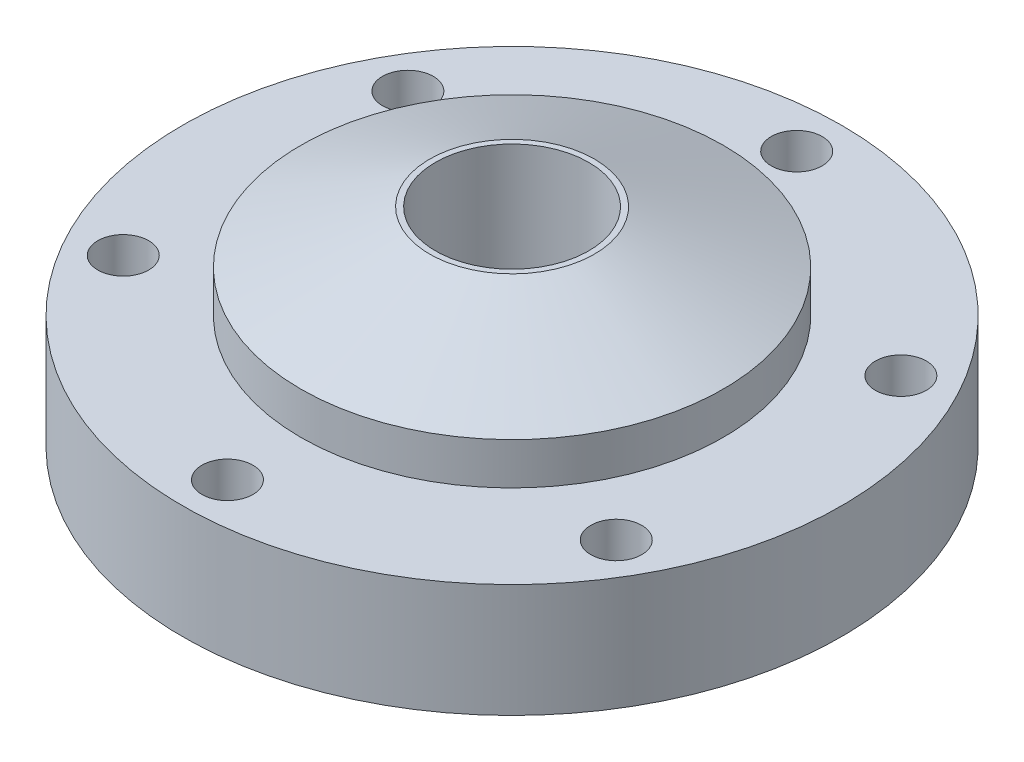
ISO-10303-21;
HEADER;
FILE_DESCRIPTION(('STEP AP214'),'2;1');
FILE_NAME('part.step','',(''),(''),'','','');
FILE_SCHEMA(('AUTOMOTIVE_DESIGN { 1 0 10303 214 1 1 1 1 }'));
ENDSEC;
DATA;
#1=APPLICATION_CONTEXT('core data for automotive mechanical design processes');
#2=APPLICATION_PROTOCOL_DEFINITION('international standard','automotive_design',2000,#1);
#3=PRODUCT_CONTEXT('',#1,'mechanical');
#4=PRODUCT('Part','Part','',(#3));
#5=PRODUCT_RELATED_PRODUCT_CATEGORY('part','',(#4));
#6=PRODUCT_DEFINITION_FORMATION('','',#4);
#7=PRODUCT_DEFINITION_CONTEXT('part definition',#1,'design');
#8=PRODUCT_DEFINITION('design','',#6,#7);
#9=PRODUCT_DEFINITION_SHAPE('','',#8);
#10=(LENGTH_UNIT() NAMED_UNIT(*) SI_UNIT(.MILLI.,.METRE.));
#11=(NAMED_UNIT(*) PLANE_ANGLE_UNIT() SI_UNIT($,.RADIAN.));
#12=(NAMED_UNIT(*) SI_UNIT($,.STERADIAN.) SOLID_ANGLE_UNIT());
#13=UNCERTAINTY_MEASURE_WITH_UNIT(LENGTH_MEASURE(1.E-05),#10,'distance_accuracy_value','');
#14=(GEOMETRIC_REPRESENTATION_CONTEXT(3) GLOBAL_UNCERTAINTY_ASSIGNED_CONTEXT((#13)) GLOBAL_UNIT_ASSIGNED_CONTEXT((#10,
#11,#12)) REPRESENTATION_CONTEXT('',''));
#15=CARTESIAN_POINT('',(0.,0.,0.));
#16=DIRECTION('',(0.,0.,1.));
#17=DIRECTION('',(1.,0.,0.));
#18=AXIS2_PLACEMENT_3D('',#15,#16,#17);
#19=CARTESIAN_POINT('',(5.12,5.,0.));
#20=DIRECTION('',(0.,-1.,0.));
#21=DIRECTION('',(0.,0.,-1.));
#22=AXIS2_PLACEMENT_3D('',#19,#20,#21);
#23=PLANE('',#22);
#24=CARTESIAN_POINT('',(0.,5.,0.));
#25=DIRECTION('',(0.,-1.,0.));
#26=DIRECTION('',(0.,0.,-1.));
#27=AXIS2_PLACEMENT_3D('',#24,#25,#26);
#28=CIRCLE('',#27,6.75);
#29=CARTESIAN_POINT('',(0.,5.,-6.75));
#30=VERTEX_POINT('',#29);
#31=EDGE_CURVE('E76',#30,#30,#28,.T.);
#32=ORIENTED_EDGE('',*,*,#31,.T.);
#33=EDGE_LOOP('',(#32));
#34=FACE_BOUND('',#33,.T.);
#35=CARTESIAN_POINT('',(0.,5.,0.));
#36=DIRECTION('',(0.,-1.,0.));
#37=DIRECTION('',(0.,0.,-1.));
#38=AXIS2_PLACEMENT_3D('',#35,#36,#37);
#39=CIRCLE('',#38,5.12);
#40=CARTESIAN_POINT('',(0.,5.,-5.12));
#41=VERTEX_POINT('',#40);
#42=EDGE_CURVE('E10',#41,#41,#39,.T.);
#43=ORIENTED_EDGE('',*,*,#42,.F.);
#44=EDGE_LOOP('',(#43));
#45=FACE_BOUND('',#44,.T.);
#46=ADVANCED_FACE('F45',(#34,#45),#23,.T.);
#47=CARTESIAN_POINT('',(0.,0.,0.));
#48=DIRECTION('',(0.,-1.,0.));
#49=DIRECTION('',(0.,0.,-1.));
#50=AXIS2_PLACEMENT_3D('',#47,#48,#49);
#51=CYLINDRICAL_SURFACE('',#50,5.12);
#52=ORIENTED_EDGE('',*,*,#42,.T.);
#53=EDGE_LOOP('',(#52));
#54=FACE_BOUND('',#53,.T.);
#55=CARTESIAN_POINT('',(0.,13.8632,0.));
#56=DIRECTION('',(0.,-1.,0.));
#57=DIRECTION('',(0.,0.,-1.));
#58=AXIS2_PLACEMENT_3D('',#55,#56,#57);
#59=CIRCLE('',#58,5.12);
#60=CARTESIAN_POINT('',(0.,13.8632,-5.12));
#61=VERTEX_POINT('',#60);
#62=EDGE_CURVE('E51',#61,#61,#59,.T.);
#63=ORIENTED_EDGE('',*,*,#62,.F.);
#64=EDGE_LOOP('',(#63));
#65=FACE_BOUND('',#64,.T.);
#66=ADVANCED_FACE('F160',(#54,#65),#51,.F.);
#67=CARTESIAN_POINT('',(5.12,13.8632,0.));
#68=DIRECTION('',(0.,1.,0.));
#69=DIRECTION('',(0.,0.,1.));
#70=AXIS2_PLACEMENT_3D('',#67,#68,#69);
#71=PLANE('',#70);
#72=ORIENTED_EDGE('',*,*,#62,.T.);
#73=EDGE_LOOP('',(#72));
#74=FACE_BOUND('',#73,.T.);
#75=CARTESIAN_POINT('',(0.,13.8632,0.));
#76=DIRECTION('',(0.,-1.,0.));
#77=DIRECTION('',(0.,0.,-1.));
#78=AXIS2_PLACEMENT_3D('',#75,#76,#77);
#79=CIRCLE('',#78,5.5);
#80=CARTESIAN_POINT('',(0.,13.8632,-5.5));
#81=VERTEX_POINT('',#80);
#82=EDGE_CURVE('E55',#81,#81,#79,.T.);
#83=ORIENTED_EDGE('',*,*,#82,.F.);
#84=EDGE_LOOP('',(#83));
#85=FACE_BOUND('',#84,.T.);
#86=ADVANCED_FACE('F164',(#74,#85),#71,.T.);
#87=CARTESIAN_POINT('',(0.,10.3613,0.));
#88=DIRECTION('',(0.,-1.,0.));
#89=DIRECTION('',(0.,0.,-1.));
#90=AXIS2_PLACEMENT_3D('',#87,#88,#89);
#91=CONICAL_SURFACE('',#90,14.1,1.18410049912583);
#92=ORIENTED_EDGE('',*,*,#82,.T.);
#93=EDGE_LOOP('',(#92));
#94=FACE_BOUND('',#93,.T.);
#95=CARTESIAN_POINT('',(0.,10.3613,0.));
#96=DIRECTION('',(0.,-1.,0.));
#97=DIRECTION('',(0.,0.,-1.));
#98=AXIS2_PLACEMENT_3D('',#95,#96,#97);
#99=CIRCLE('',#98,14.1);
#100=CARTESIAN_POINT('',(0.,10.3613,-14.1));
#101=VERTEX_POINT('',#100);
#102=EDGE_CURVE('E59',#101,#101,#99,.T.);
#103=ORIENTED_EDGE('',*,*,#102,.F.);
#104=EDGE_LOOP('',(#103));
#105=FACE_BOUND('',#104,.T.);
#106=ADVANCED_FACE('F168',(#94,#105),#91,.T.);
#107=CARTESIAN_POINT('',(0.,0.,0.));
#108=DIRECTION('',(0.,-1.,0.));
#109=DIRECTION('',(0.,0.,-1.));
#110=AXIS2_PLACEMENT_3D('',#107,#108,#109);
#111=CYLINDRICAL_SURFACE('',#110,14.1);
#112=ORIENTED_EDGE('',*,*,#102,.T.);
#113=EDGE_LOOP('',(#112));
#114=FACE_BOUND('',#113,.T.);
#115=CARTESIAN_POINT('',(0.,7.5673,0.));
#116=DIRECTION('',(0.,-1.,0.));
#117=DIRECTION('',(0.,0.,-1.));
#118=AXIS2_PLACEMENT_3D('',#115,#116,#117);
#119=CIRCLE('',#118,14.1);
#120=CARTESIAN_POINT('',(0.,7.5673,-14.1));
#121=VERTEX_POINT('',#120);
#122=EDGE_CURVE('E64',#121,#121,#119,.T.);
#123=ORIENTED_EDGE('',*,*,#122,.F.);
#124=EDGE_LOOP('',(#123));
#125=FACE_BOUND('',#124,.T.);
#126=ADVANCED_FACE('F123',(#114,#125),#111,.T.);
#127=CARTESIAN_POINT('',(14.1,7.5673,0.));
#128=DIRECTION('',(0.,1.,0.));
#129=DIRECTION('',(0.,0.,1.));
#130=AXIS2_PLACEMENT_3D('',#127,#128,#129);
#131=PLANE('',#130);
#132=CARTESIAN_POINT('',(0.,7.5673,-19.));
#133=DIRECTION('',(0.,1.,0.));
#134=DIRECTION('',(0.,0.,1.));
#135=AXIS2_PLACEMENT_3D('',#132,#133,#134);
#136=CIRCLE('',#135,1.69999999999999);
#137=CARTESIAN_POINT('',(0.,7.5673,-17.3));
#138=VERTEX_POINT('',#137);
#139=EDGE_CURVE('E112',#138,#138,#136,.T.);
#140=ORIENTED_EDGE('',*,*,#139,.F.);
#141=EDGE_LOOP('',(#140));
#142=FACE_BOUND('',#141,.T.);
#143=CARTESIAN_POINT('',(16.4544826719043,7.5673,-9.5));
#144=DIRECTION('',(0.,1.,0.));
#145=DIRECTION('',(0.,0.,1.));
#146=AXIS2_PLACEMENT_3D('',#143,#144,#145);
#147=CIRCLE('',#146,1.69999999999999);
#148=CARTESIAN_POINT('',(16.4544826719043,7.5673,-7.80000000000001));
#149=VERTEX_POINT('',#148);
#150=EDGE_CURVE('E106',#149,#149,#147,.T.);
#151=ORIENTED_EDGE('',*,*,#150,.F.);
#152=EDGE_LOOP('',(#151));
#153=FACE_BOUND('',#152,.T.);
#154=CARTESIAN_POINT('',(16.4544826719043,7.5673,9.5));
#155=DIRECTION('',(0.,1.,0.));
#156=DIRECTION('',(0.,0.,1.));
#157=AXIS2_PLACEMENT_3D('',#154,#155,#156);
#158=CIRCLE('',#157,1.69999999999999);
#159=CARTESIAN_POINT('',(16.4544826719043,7.5673,11.2));
#160=VERTEX_POINT('',#159);
#161=EDGE_CURVE('E100',#160,#160,#158,.T.);
#162=ORIENTED_EDGE('',*,*,#161,.F.);
#163=EDGE_LOOP('',(#162));
#164=FACE_BOUND('',#163,.T.);
#165=CARTESIAN_POINT('',(0.,7.5673,19.));
#166=DIRECTION('',(0.,1.,0.));
#167=DIRECTION('',(0.,0.,1.));
#168=AXIS2_PLACEMENT_3D('',#165,#166,#167);
#169=CIRCLE('',#168,1.69999999999999);
#170=CARTESIAN_POINT('',(0.,7.5673,20.7));
#171=VERTEX_POINT('',#170);
#172=EDGE_CURVE('E94',#171,#171,#169,.T.);
#173=ORIENTED_EDGE('',*,*,#172,.F.);
#174=EDGE_LOOP('',(#173));
#175=FACE_BOUND('',#174,.T.);
#176=CARTESIAN_POINT('',(-16.4544826719043,7.5673,9.50000000000001));
#177=DIRECTION('',(0.,1.,0.));
#178=DIRECTION('',(0.,0.,1.));
#179=AXIS2_PLACEMENT_3D('',#176,#177,#178);
#180=CIRCLE('',#179,1.69999999999999);
#181=CARTESIAN_POINT('',(-16.4544826719043,7.5673,11.2));
#182=VERTEX_POINT('',#181);
#183=EDGE_CURVE('E88',#182,#182,#180,.T.);
#184=ORIENTED_EDGE('',*,*,#183,.F.);
#185=EDGE_LOOP('',(#184));
#186=FACE_BOUND('',#185,.T.);
#187=CARTESIAN_POINT('',(-16.4544826719043,7.5673,-9.5));
#188=DIRECTION('',(0.,1.,0.));
#189=DIRECTION('',(0.,0.,1.));
#190=AXIS2_PLACEMENT_3D('',#187,#188,#189);
#191=CIRCLE('',#190,1.69999999999999);
#192=CARTESIAN_POINT('',(-16.4544826719043,7.5673,-7.80000000000001));
#193=VERTEX_POINT('',#192);
#194=EDGE_CURVE('E82',#193,#193,#191,.T.);
#195=ORIENTED_EDGE('',*,*,#194,.F.);
#196=EDGE_LOOP('',(#195));
#197=FACE_BOUND('',#196,.T.);
#198=ORIENTED_EDGE('',*,*,#122,.T.);
#199=EDGE_LOOP('',(#198));
#200=FACE_BOUND('',#199,.T.);
#201=CARTESIAN_POINT('',(0.,7.5673,0.));
#202=DIRECTION('',(0.,-1.,0.));
#203=DIRECTION('',(0.,0.,-1.));
#204=AXIS2_PLACEMENT_3D('',#201,#202,#203);
#205=CIRCLE('',#204,22.);
#206=CARTESIAN_POINT('',(0.,7.5673,-22.));
#207=VERTEX_POINT('',#206);
#208=EDGE_CURVE('E67',#207,#207,#205,.T.);
#209=ORIENTED_EDGE('',*,*,#208,.F.);
#210=EDGE_LOOP('',(#209));
#211=FACE_BOUND('',#210,.T.);
#212=ADVANCED_FACE('F119',(#142,#153,#164,#175,#186,#197,#200,#211),#131,.T.);
#213=CARTESIAN_POINT('',(0.,0.,0.));
#214=DIRECTION('',(0.,-1.,0.));
#215=DIRECTION('',(0.,0.,-1.));
#216=AXIS2_PLACEMENT_3D('',#213,#214,#215);
#217=CYLINDRICAL_SURFACE('',#216,22.);
#218=ORIENTED_EDGE('',*,*,#208,.T.);
#219=EDGE_LOOP('',(#218));
#220=FACE_BOUND('',#219,.T.);
#221=CARTESIAN_POINT('',(0.,0.,0.));
#222=DIRECTION('',(0.,-1.,0.));
#223=DIRECTION('',(0.,0.,-1.));
#224=AXIS2_PLACEMENT_3D('',#221,#222,#223);
#225=CIRCLE('',#224,22.);
#226=CARTESIAN_POINT('',(0.,0.,-22.));
#227=VERTEX_POINT('',#226);
#228=EDGE_CURVE('E70',#227,#227,#225,.T.);
#229=ORIENTED_EDGE('',*,*,#228,.F.);
#230=EDGE_LOOP('',(#229));
#231=FACE_BOUND('',#230,.T.);
#232=ADVANCED_FACE('F122',(#220,#231),#217,.T.);
#233=CARTESIAN_POINT('',(22.,0.,0.));
#234=DIRECTION('',(0.,-1.,0.));
#235=DIRECTION('',(0.,0.,-1.));
#236=AXIS2_PLACEMENT_3D('',#233,#234,#235);
#237=PLANE('',#236);
#238=CARTESIAN_POINT('',(0.,0.,-19.));
#239=DIRECTION('',(0.,-1.,0.));
#240=DIRECTION('',(0.,0.,-1.));
#241=AXIS2_PLACEMENT_3D('',#238,#239,#240);
#242=CIRCLE('',#241,1.69999999999999);
#243=CARTESIAN_POINT('',(0.,0.,-20.7));
#244=VERTEX_POINT('',#243);
#245=EDGE_CURVE('E109',#244,#244,#242,.T.);
#246=ORIENTED_EDGE('',*,*,#245,.F.);
#247=EDGE_LOOP('',(#246));
#248=FACE_BOUND('',#247,.T.);
#249=CARTESIAN_POINT('',(16.4544826719043,0.,-9.5));
#250=DIRECTION('',(0.,-1.,0.));
#251=DIRECTION('',(0.,0.,-1.));
#252=AXIS2_PLACEMENT_3D('',#249,#250,#251);
#253=CIRCLE('',#252,1.69999999999999);
#254=CARTESIAN_POINT('',(16.4544826719043,0.,-11.2));
#255=VERTEX_POINT('',#254);
#256=EDGE_CURVE('E103',#255,#255,#253,.T.);
#257=ORIENTED_EDGE('',*,*,#256,.F.);
#258=EDGE_LOOP('',(#257));
#259=FACE_BOUND('',#258,.T.);
#260=CARTESIAN_POINT('',(16.4544826719043,0.,9.5));
#261=DIRECTION('',(0.,-1.,0.));
#262=DIRECTION('',(0.,0.,-1.));
#263=AXIS2_PLACEMENT_3D('',#260,#261,#262);
#264=CIRCLE('',#263,1.69999999999999);
#265=CARTESIAN_POINT('',(16.4544826719043,0.,7.80000000000001));
#266=VERTEX_POINT('',#265);
#267=EDGE_CURVE('E97',#266,#266,#264,.T.);
#268=ORIENTED_EDGE('',*,*,#267,.F.);
#269=EDGE_LOOP('',(#268));
#270=FACE_BOUND('',#269,.T.);
#271=CARTESIAN_POINT('',(0.,0.,19.));
#272=DIRECTION('',(0.,-1.,0.));
#273=DIRECTION('',(0.,0.,-1.));
#274=AXIS2_PLACEMENT_3D('',#271,#272,#273);
#275=CIRCLE('',#274,1.69999999999999);
#276=CARTESIAN_POINT('',(0.,0.,17.3));
#277=VERTEX_POINT('',#276);
#278=EDGE_CURVE('E91',#277,#277,#275,.T.);
#279=ORIENTED_EDGE('',*,*,#278,.F.);
#280=EDGE_LOOP('',(#279));
#281=FACE_BOUND('',#280,.T.);
#282=CARTESIAN_POINT('',(-16.4544826719043,0.,9.50000000000001));
#283=DIRECTION('',(0.,-1.,0.));
#284=DIRECTION('',(0.,0.,-1.));
#285=AXIS2_PLACEMENT_3D('',#282,#283,#284);
#286=CIRCLE('',#285,1.69999999999999);
#287=CARTESIAN_POINT('',(-16.4544826719043,0.,7.80000000000001));
#288=VERTEX_POINT('',#287);
#289=EDGE_CURVE('E85',#288,#288,#286,.T.);
#290=ORIENTED_EDGE('',*,*,#289,.F.);
#291=EDGE_LOOP('',(#290));
#292=FACE_BOUND('',#291,.T.);
#293=CARTESIAN_POINT('',(-16.4544826719043,0.,-9.5));
#294=DIRECTION('',(0.,-1.,0.));
#295=DIRECTION('',(0.,0.,-1.));
#296=AXIS2_PLACEMENT_3D('',#293,#294,#295);
#297=CIRCLE('',#296,1.69999999999999);
#298=CARTESIAN_POINT('',(-16.4544826719043,0.,-11.2));
#299=VERTEX_POINT('',#298);
#300=EDGE_CURVE('E79',#299,#299,#297,.T.);
#301=ORIENTED_EDGE('',*,*,#300,.F.);
#302=EDGE_LOOP('',(#301));
#303=FACE_BOUND('',#302,.T.);
#304=ORIENTED_EDGE('',*,*,#228,.T.);
#305=EDGE_LOOP('',(#304));
#306=FACE_BOUND('',#305,.T.);
#307=CARTESIAN_POINT('',(0.,0.,0.));
#308=DIRECTION('',(0.,-1.,0.));
#309=DIRECTION('',(0.,0.,-1.));
#310=AXIS2_PLACEMENT_3D('',#307,#308,#309);
#311=CIRCLE('',#310,6.75);
#312=CARTESIAN_POINT('',(0.,0.,-6.75));
#313=VERTEX_POINT('',#312);
#314=EDGE_CURVE('E73',#313,#313,#311,.T.);
#315=ORIENTED_EDGE('',*,*,#314,.F.);
#316=EDGE_LOOP('',(#315));
#317=FACE_BOUND('',#316,.T.);
#318=ADVANCED_FACE('F141',(#248,#259,#270,#281,#292,#303,#306,#317),#237,.T.);
#319=CARTESIAN_POINT('',(0.,0.,0.));
#320=DIRECTION('',(0.,-1.,0.));
#321=DIRECTION('',(0.,0.,-1.));
#322=AXIS2_PLACEMENT_3D('',#319,#320,#321);
#323=CYLINDRICAL_SURFACE('',#322,6.75);
#324=ORIENTED_EDGE('',*,*,#314,.T.);
#325=EDGE_LOOP('',(#324));
#326=FACE_BOUND('',#325,.T.);
#327=ORIENTED_EDGE('',*,*,#31,.F.);
#328=EDGE_LOOP('',(#327));
#329=FACE_BOUND('',#328,.T.);
#330=ADVANCED_FACE('F147',(#326,#329),#323,.F.);
#331=CARTESIAN_POINT('',(-16.4544826719043,7.5673,-9.5));
#332=DIRECTION('',(0.,1.,0.));
#333=DIRECTION('',(0.,0.,1.));
#334=AXIS2_PLACEMENT_3D('',#331,#332,#333);
#335=CYLINDRICAL_SURFACE('',#334,1.69999999999999);
#336=ORIENTED_EDGE('',*,*,#194,.T.);
#337=EDGE_LOOP('',(#336));
#338=FACE_BOUND('',#337,.T.);
#339=ORIENTED_EDGE('',*,*,#300,.T.);
#340=EDGE_LOOP('',(#339));
#341=FACE_BOUND('',#340,.T.);
#342=ADVANCED_FACE('F154',(#338,#341),#335,.F.);
#343=CARTESIAN_POINT('',(-16.4544826719043,7.5673,9.50000000000001));
#344=DIRECTION('',(0.,1.,0.));
#345=DIRECTION('',(0.,0.,1.));
#346=AXIS2_PLACEMENT_3D('',#343,#344,#345);
#347=CYLINDRICAL_SURFACE('',#346,1.69999999999999);
#348=ORIENTED_EDGE('',*,*,#183,.T.);
#349=EDGE_LOOP('',(#348));
#350=FACE_BOUND('',#349,.T.);
#351=ORIENTED_EDGE('',*,*,#289,.T.);
#352=EDGE_LOOP('',(#351));
#353=FACE_BOUND('',#352,.T.);
#354=ADVANCED_FACE('F180',(#350,#353),#347,.F.);
#355=CARTESIAN_POINT('',(0.,7.5673,19.));
#356=DIRECTION('',(0.,1.,0.));
#357=DIRECTION('',(0.,0.,1.));
#358=AXIS2_PLACEMENT_3D('',#355,#356,#357);
#359=CYLINDRICAL_SURFACE('',#358,1.69999999999999);
#360=ORIENTED_EDGE('',*,*,#172,.T.);
#361=EDGE_LOOP('',(#360));
#362=FACE_BOUND('',#361,.T.);
#363=ORIENTED_EDGE('',*,*,#278,.T.);
#364=EDGE_LOOP('',(#363));
#365=FACE_BOUND('',#364,.T.);
#366=ADVANCED_FACE('F184',(#362,#365),#359,.F.);
#367=CARTESIAN_POINT('',(16.4544826719043,7.5673,9.5));
#368=DIRECTION('',(0.,1.,0.));
#369=DIRECTION('',(0.,0.,1.));
#370=AXIS2_PLACEMENT_3D('',#367,#368,#369);
#371=CYLINDRICAL_SURFACE('',#370,1.69999999999999);
#372=ORIENTED_EDGE('',*,*,#161,.T.);
#373=EDGE_LOOP('',(#372));
#374=FACE_BOUND('',#373,.T.);
#375=ORIENTED_EDGE('',*,*,#267,.T.);
#376=EDGE_LOOP('',(#375));
#377=FACE_BOUND('',#376,.T.);
#378=ADVANCED_FACE('F188',(#374,#377),#371,.F.);
#379=CARTESIAN_POINT('',(16.4544826719043,7.5673,-9.5));
#380=DIRECTION('',(0.,1.,0.));
#381=DIRECTION('',(0.,0.,1.));
#382=AXIS2_PLACEMENT_3D('',#379,#380,#381);
#383=CYLINDRICAL_SURFACE('',#382,1.69999999999999);
#384=ORIENTED_EDGE('',*,*,#150,.T.);
#385=EDGE_LOOP('',(#384));
#386=FACE_BOUND('',#385,.T.);
#387=ORIENTED_EDGE('',*,*,#256,.T.);
#388=EDGE_LOOP('',(#387));
#389=FACE_BOUND('',#388,.T.);
#390=ADVANCED_FACE('F192',(#386,#389),#383,.F.);
#391=CARTESIAN_POINT('',(0.,7.5673,-19.));
#392=DIRECTION('',(0.,1.,0.));
#393=DIRECTION('',(0.,0.,1.));
#394=AXIS2_PLACEMENT_3D('',#391,#392,#393);
#395=CYLINDRICAL_SURFACE('',#394,1.69999999999999);
#396=ORIENTED_EDGE('',*,*,#139,.T.);
#397=EDGE_LOOP('',(#396));
#398=FACE_BOUND('',#397,.T.);
#399=ORIENTED_EDGE('',*,*,#245,.T.);
#400=EDGE_LOOP('',(#399));
#401=FACE_BOUND('',#400,.T.);
#402=ADVANCED_FACE('F116',(#398,#401),#395,.F.);
#403=CLOSED_SHELL('',(#46,#66,#86,#106,#126,#212,#232,#318,#330,#342,#354,#366,#378,#390,#402));
#404=MANIFOLD_SOLID_BREP('B2',#403);
#405=ADVANCED_BREP_SHAPE_REPRESENTATION('',(#18,#404),#14);
#406=SHAPE_DEFINITION_REPRESENTATION(#9,#405);
ENDSEC;
END-ISO-10303-21;
